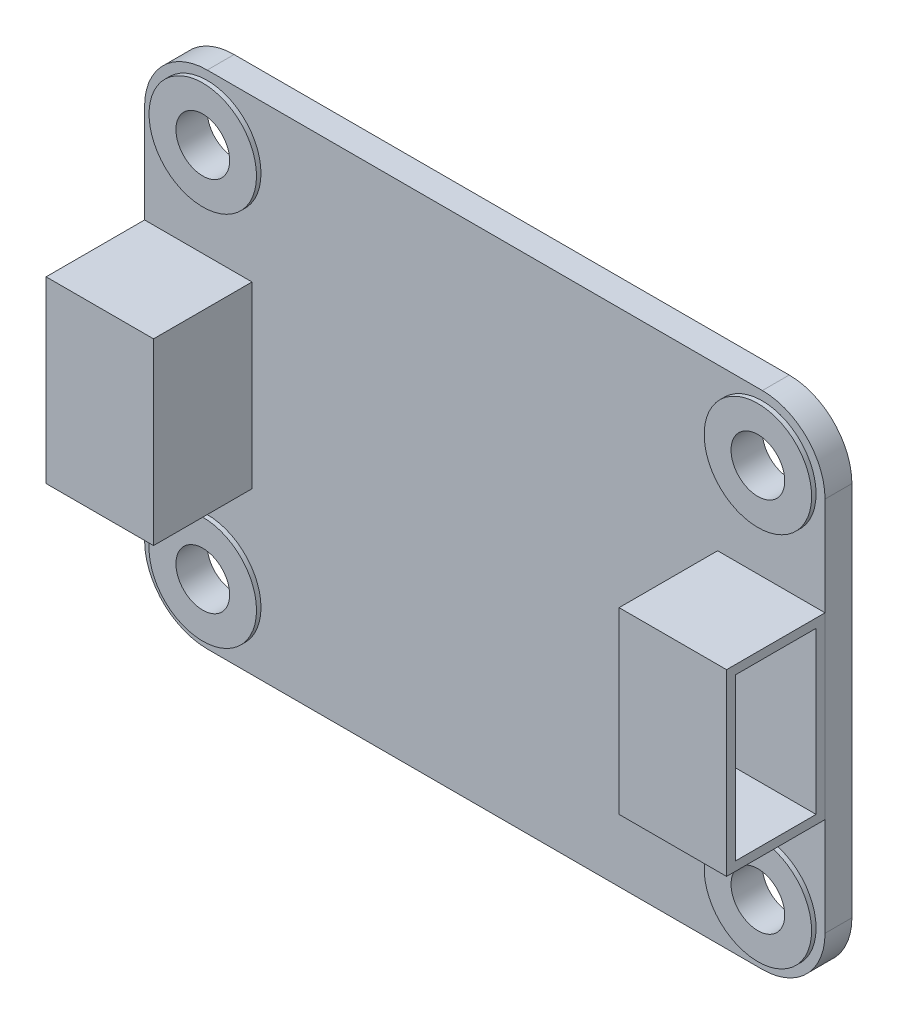
ISO-10303-21;
HEADER;
FILE_DESCRIPTION(('STEP AP214'),'2;1');
FILE_NAME('part.step','',(''),(''),'','','');
FILE_SCHEMA(('AUTOMOTIVE_DESIGN { 1 0 10303 214 1 1 1 1 }'));
ENDSEC;
DATA;
#1=APPLICATION_CONTEXT('core data for automotive mechanical design processes');
#2=APPLICATION_PROTOCOL_DEFINITION('international standard','automotive_design',2000,#1);
#3=PRODUCT_CONTEXT('',#1,'mechanical');
#4=PRODUCT('Part','Part','',(#3));
#5=PRODUCT_RELATED_PRODUCT_CATEGORY('part','',(#4));
#6=PRODUCT_DEFINITION_FORMATION('','',#4);
#7=PRODUCT_DEFINITION_CONTEXT('part definition',#1,'design');
#8=PRODUCT_DEFINITION('design','',#6,#7);
#9=PRODUCT_DEFINITION_SHAPE('','',#8);
#10=(LENGTH_UNIT() NAMED_UNIT(*) SI_UNIT(.MILLI.,.METRE.));
#11=(NAMED_UNIT(*) PLANE_ANGLE_UNIT() SI_UNIT($,.RADIAN.));
#12=(NAMED_UNIT(*) SI_UNIT($,.STERADIAN.) SOLID_ANGLE_UNIT());
#13=UNCERTAINTY_MEASURE_WITH_UNIT(LENGTH_MEASURE(1.E-05),#10,'distance_accuracy_value','');
#14=(GEOMETRIC_REPRESENTATION_CONTEXT(3) GLOBAL_UNCERTAINTY_ASSIGNED_CONTEXT((#13)) GLOBAL_UNIT_ASSIGNED_CONTEXT((#10,
#11,#12)) REPRESENTATION_CONTEXT('',''));
#15=CARTESIAN_POINT('',(0.,0.,0.));
#16=DIRECTION('',(0.,0.,1.));
#17=DIRECTION('',(1.,0.,0.));
#18=AXIS2_PLACEMENT_3D('',#15,#16,#17);
#19=CARTESIAN_POINT('',(-19.,5.,7.));
#20=DIRECTION('',(1.,0.,0.));
#21=DIRECTION('',(0.,0.,1.));
#22=AXIS2_PLACEMENT_3D('',#19,#20,#21);
#23=PLANE('',#22);
#24=DIRECTION('',(0.,1.,0.));
#25=VECTOR('',#24,1.);
#26=CARTESIAN_POINT('',(-19.,5.,1.5));
#27=LINE('',#26,#25);
#28=CARTESIAN_POINT('',(-19.,-5.,1.5));
#29=VERTEX_POINT('',#28);
#30=CARTESIAN_POINT('',(-19.,5.,1.5));
#31=VERTEX_POINT('',#30);
#32=EDGE_CURVE('E164',#29,#31,#27,.T.);
#33=ORIENTED_EDGE('',*,*,#32,.F.);
#34=DIRECTION('',(0.,0.,-1.));
#35=VECTOR('',#34,1.);
#36=CARTESIAN_POINT('',(-19.,-5.,7.));
#37=LINE('',#36,#35);
#38=CARTESIAN_POINT('',(-19.,-5.,7.));
#39=VERTEX_POINT('',#38);
#40=EDGE_CURVE('E176',#39,#29,#37,.T.);
#41=ORIENTED_EDGE('',*,*,#40,.F.);
#42=DIRECTION('',(0.,1.,0.));
#43=VECTOR('',#42,1.);
#44=CARTESIAN_POINT('',(-19.,5.,7.));
#45=LINE('',#44,#43);
#46=CARTESIAN_POINT('',(-19.,5.,7.));
#47=VERTEX_POINT('',#46);
#48=EDGE_CURVE('E168',#39,#47,#45,.T.);
#49=ORIENTED_EDGE('',*,*,#48,.T.);
#50=DIRECTION('',(0.,0.,-1.));
#51=VECTOR('',#50,1.);
#52=CARTESIAN_POINT('',(-19.,5.,7.));
#53=LINE('',#52,#51);
#54=EDGE_CURVE('E12',#47,#31,#53,.T.);
#55=ORIENTED_EDGE('',*,*,#54,.T.);
#56=EDGE_LOOP('',(#33,#41,#49,#55));
#57=FACE_BOUND('',#56,.T.);
#58=DIRECTION('',(0.,1.,0.));
#59=VECTOR('',#58,1.);
#60=CARTESIAN_POINT('',(-19.,0.,2.));
#61=LINE('',#60,#59);
#62=CARTESIAN_POINT('',(-19.,-4.5,2.));
#63=VERTEX_POINT('',#62);
#64=CARTESIAN_POINT('',(-19.,4.5,2.));
#65=VERTEX_POINT('',#64);
#66=EDGE_CURVE('E151',#63,#65,#61,.T.);
#67=ORIENTED_EDGE('',*,*,#66,.T.);
#68=DIRECTION('',(0.,0.,-1.));
#69=VECTOR('',#68,1.);
#70=CARTESIAN_POINT('',(-19.,4.5,7.));
#71=LINE('',#70,#69);
#72=CARTESIAN_POINT('',(-19.,4.5,6.5));
#73=VERTEX_POINT('',#72);
#74=EDGE_CURVE('E145',#73,#65,#71,.T.);
#75=ORIENTED_EDGE('',*,*,#74,.F.);
#76=DIRECTION('',(0.,1.,0.));
#77=VECTOR('',#76,1.);
#78=CARTESIAN_POINT('',(-19.,0.,6.5));
#79=LINE('',#78,#77);
#80=CARTESIAN_POINT('',(-19.,-4.5,6.5));
#81=VERTEX_POINT('',#80);
#82=EDGE_CURVE('E156',#81,#73,#79,.T.);
#83=ORIENTED_EDGE('',*,*,#82,.F.);
#84=DIRECTION('',(0.,0.,-1.));
#85=VECTOR('',#84,1.);
#86=CARTESIAN_POINT('',(-19.,-4.5,7.));
#87=LINE('',#86,#85);
#88=EDGE_CURVE('E159',#81,#63,#87,.T.);
#89=ORIENTED_EDGE('',*,*,#88,.T.);
#90=EDGE_LOOP('',(#67,#75,#83,#89));
#91=FACE_BOUND('',#90,.T.);
#92=ADVANCED_FACE('F54',(#57,#91),#23,.F.);
#93=CARTESIAN_POINT('',(-19.,5.,7.));
#94=DIRECTION('',(0.,-1.,0.));
#95=DIRECTION('',(-1.,0.,0.));
#96=AXIS2_PLACEMENT_3D('',#93,#94,#95);
#97=PLANE('',#96);
#98=DIRECTION('',(1.,0.,0.));
#99=VECTOR('',#98,1.);
#100=CARTESIAN_POINT('',(-19.,5.,1.5));
#101=LINE('',#100,#99);
#102=CARTESIAN_POINT('',(-13.,5.,1.5));
#103=VERTEX_POINT('',#102);
#104=EDGE_CURVE('E178',#31,#103,#101,.T.);
#105=ORIENTED_EDGE('',*,*,#104,.F.);
#106=ORIENTED_EDGE('',*,*,#54,.F.);
#107=DIRECTION('',(1.,0.,0.));
#108=VECTOR('',#107,1.);
#109=CARTESIAN_POINT('',(-19.,5.,7.));
#110=LINE('',#109,#108);
#111=CARTESIAN_POINT('',(-13.,5.,7.));
#112=VERTEX_POINT('',#111);
#113=EDGE_CURVE('E104',#47,#112,#110,.T.);
#114=ORIENTED_EDGE('',*,*,#113,.T.);
#115=DIRECTION('',(0.,0.,-1.));
#116=VECTOR('',#115,1.);
#117=CARTESIAN_POINT('',(-13.,5.,7.));
#118=LINE('',#117,#116);
#119=EDGE_CURVE('E61',#112,#103,#118,.T.);
#120=ORIENTED_EDGE('',*,*,#119,.T.);
#121=EDGE_LOOP('',(#105,#106,#114,#120));
#122=FACE_BOUND('',#121,.T.);
#123=ADVANCED_FACE('F190',(#122),#97,.F.);
#124=CARTESIAN_POINT('',(-13.,5.,7.));
#125=DIRECTION('',(-1.,0.,0.));
#126=DIRECTION('',(0.,0.,-1.));
#127=AXIS2_PLACEMENT_3D('',#124,#125,#126);
#128=PLANE('',#127);
#129=DIRECTION('',(0.,-1.,0.));
#130=VECTOR('',#129,1.);
#131=CARTESIAN_POINT('',(-13.,5.,1.5));
#132=LINE('',#131,#130);
#133=CARTESIAN_POINT('',(-13.,-5.,1.5));
#134=VERTEX_POINT('',#133);
#135=EDGE_CURVE('E181',#103,#134,#132,.T.);
#136=ORIENTED_EDGE('',*,*,#135,.F.);
#137=ORIENTED_EDGE('',*,*,#119,.F.);
#138=DIRECTION('',(0.,-1.,0.));
#139=VECTOR('',#138,1.);
#140=CARTESIAN_POINT('',(-13.,5.,7.));
#141=LINE('',#140,#139);
#142=CARTESIAN_POINT('',(-13.,-5.,7.));
#143=VERTEX_POINT('',#142);
#144=EDGE_CURVE('E172',#112,#143,#141,.T.);
#145=ORIENTED_EDGE('',*,*,#144,.T.);
#146=DIRECTION('',(0.,0.,-1.));
#147=VECTOR('',#146,1.);
#148=CARTESIAN_POINT('',(-13.,-5.,7.));
#149=LINE('',#148,#147);
#150=EDGE_CURVE('E185',#143,#134,#149,.T.);
#151=ORIENTED_EDGE('',*,*,#150,.T.);
#152=EDGE_LOOP('',(#136,#137,#145,#151));
#153=FACE_BOUND('',#152,.T.);
#154=ADVANCED_FACE('F199',(#153),#128,.F.);
#155=CARTESIAN_POINT('',(-19.,-5.,7.));
#156=DIRECTION('',(0.,1.,0.));
#157=DIRECTION('',(1.,0.,0.));
#158=AXIS2_PLACEMENT_3D('',#155,#156,#157);
#159=PLANE('',#158);
#160=DIRECTION('',(-1.,0.,0.));
#161=VECTOR('',#160,1.);
#162=CARTESIAN_POINT('',(-19.,-5.,1.5));
#163=LINE('',#162,#161);
#164=EDGE_CURVE('E98',#134,#29,#163,.T.);
#165=ORIENTED_EDGE('',*,*,#164,.F.);
#166=ORIENTED_EDGE('',*,*,#150,.F.);
#167=DIRECTION('',(-1.,0.,0.));
#168=VECTOR('',#167,1.);
#169=CARTESIAN_POINT('',(-19.,-5.,7.));
#170=LINE('',#169,#168);
#171=EDGE_CURVE('E77',#143,#39,#170,.T.);
#172=ORIENTED_EDGE('',*,*,#171,.T.);
#173=ORIENTED_EDGE('',*,*,#40,.T.);
#174=EDGE_LOOP('',(#165,#166,#172,#173));
#175=FACE_BOUND('',#174,.T.);
#176=ADVANCED_FACE('F198',(#175),#159,.F.);
#177=CARTESIAN_POINT('',(0.,0.,7.));
#178=DIRECTION('',(0.,0.,-1.));
#179=DIRECTION('',(1.,0.,0.));
#180=AXIS2_PLACEMENT_3D('',#177,#178,#179);
#181=PLANE('',#180);
#182=ORIENTED_EDGE('',*,*,#48,.F.);
#183=ORIENTED_EDGE('',*,*,#171,.F.);
#184=ORIENTED_EDGE('',*,*,#144,.F.);
#185=ORIENTED_EDGE('',*,*,#113,.F.);
#186=EDGE_LOOP('',(#182,#183,#184,#185));
#187=FACE_BOUND('',#186,.T.);
#188=ADVANCED_FACE('F197',(#187),#181,.F.);
#189=CARTESIAN_POINT('',(0.,0.,1.5));
#190=DIRECTION('',(0.,0.,-1.));
#191=DIRECTION('',(1.,0.,0.));
#192=AXIS2_PLACEMENT_3D('',#189,#190,#191);
#193=PLANE('',#192);
#194=ORIENTED_EDGE('',*,*,#32,.T.);
#195=ORIENTED_EDGE('',*,*,#104,.T.);
#196=ORIENTED_EDGE('',*,*,#135,.T.);
#197=ORIENTED_EDGE('',*,*,#164,.T.);
#198=EDGE_LOOP('',(#194,#195,#196,#197));
#199=FACE_BOUND('',#198,.T.);
#200=ADVANCED_FACE('F192',(#199),#193,.T.);
#201=CARTESIAN_POINT('',(-19.,4.5,7.));
#202=DIRECTION('',(0.,-1.,0.));
#203=DIRECTION('',(-1.,0.,0.));
#204=AXIS2_PLACEMENT_3D('',#201,#202,#203);
#205=PLANE('',#204);
#206=DIRECTION('',(1.,0.,0.));
#207=VECTOR('',#206,1.);
#208=CARTESIAN_POINT('',(0.,4.5,2.));
#209=LINE('',#208,#207);
#210=CARTESIAN_POINT('',(-13.5,4.5,2.));
#211=VERTEX_POINT('',#210);
#212=EDGE_CURVE('E132',#65,#211,#209,.T.);
#213=ORIENTED_EDGE('',*,*,#212,.T.);
#214=DIRECTION('',(0.,0.,-1.));
#215=VECTOR('',#214,1.);
#216=CARTESIAN_POINT('',(-13.5,4.5,7.));
#217=LINE('',#216,#215);
#218=CARTESIAN_POINT('',(-13.5,4.5,6.5));
#219=VERTEX_POINT('',#218);
#220=EDGE_CURVE('E140',#219,#211,#217,.T.);
#221=ORIENTED_EDGE('',*,*,#220,.F.);
#222=DIRECTION('',(1.,0.,0.));
#223=VECTOR('',#222,1.);
#224=CARTESIAN_POINT('',(0.,4.5,6.5));
#225=LINE('',#224,#223);
#226=EDGE_CURVE('E155',#73,#219,#225,.T.);
#227=ORIENTED_EDGE('',*,*,#226,.F.);
#228=ORIENTED_EDGE('',*,*,#74,.T.);
#229=EDGE_LOOP('',(#213,#221,#227,#228));
#230=FACE_BOUND('',#229,.T.);
#231=ADVANCED_FACE('F148',(#230),#205,.T.);
#232=CARTESIAN_POINT('',(-13.5,5.,7.));
#233=DIRECTION('',(-1.,0.,0.));
#234=DIRECTION('',(0.,0.,-1.));
#235=AXIS2_PLACEMENT_3D('',#232,#233,#234);
#236=PLANE('',#235);
#237=DIRECTION('',(0.,-1.,0.));
#238=VECTOR('',#237,1.);
#239=CARTESIAN_POINT('',(-13.5,0.,2.));
#240=LINE('',#239,#238);
#241=CARTESIAN_POINT('',(-13.5,-4.5,2.));
#242=VERTEX_POINT('',#241);
#243=EDGE_CURVE('E127',#211,#242,#240,.T.);
#244=ORIENTED_EDGE('',*,*,#243,.T.);
#245=DIRECTION('',(0.,0.,-1.));
#246=VECTOR('',#245,1.);
#247=CARTESIAN_POINT('',(-13.5,-4.5,7.));
#248=LINE('',#247,#246);
#249=CARTESIAN_POINT('',(-13.5,-4.5,6.5));
#250=VERTEX_POINT('',#249);
#251=EDGE_CURVE('E146',#250,#242,#248,.T.);
#252=ORIENTED_EDGE('',*,*,#251,.F.);
#253=DIRECTION('',(0.,-1.,0.));
#254=VECTOR('',#253,1.);
#255=CARTESIAN_POINT('',(-13.5,0.,6.5));
#256=LINE('',#255,#254);
#257=EDGE_CURVE('E142',#219,#250,#256,.T.);
#258=ORIENTED_EDGE('',*,*,#257,.F.);
#259=ORIENTED_EDGE('',*,*,#220,.T.);
#260=EDGE_LOOP('',(#244,#252,#258,#259));
#261=FACE_BOUND('',#260,.T.);
#262=ADVANCED_FACE('F141',(#261),#236,.T.);
#263=CARTESIAN_POINT('',(-19.,-4.5,7.));
#264=DIRECTION('',(0.,1.,0.));
#265=DIRECTION('',(1.,0.,0.));
#266=AXIS2_PLACEMENT_3D('',#263,#264,#265);
#267=PLANE('',#266);
#268=DIRECTION('',(-1.,0.,0.));
#269=VECTOR('',#268,1.);
#270=CARTESIAN_POINT('',(0.,-4.50000000000001,2.));
#271=LINE('',#270,#269);
#272=EDGE_CURVE('E134',#242,#63,#271,.T.);
#273=ORIENTED_EDGE('',*,*,#272,.T.);
#274=ORIENTED_EDGE('',*,*,#88,.F.);
#275=DIRECTION('',(-1.,0.,0.));
#276=VECTOR('',#275,1.);
#277=CARTESIAN_POINT('',(0.,-4.50000000000001,6.5));
#278=LINE('',#277,#276);
#279=EDGE_CURVE('E68',#250,#81,#278,.T.);
#280=ORIENTED_EDGE('',*,*,#279,.F.);
#281=ORIENTED_EDGE('',*,*,#251,.T.);
#282=EDGE_LOOP('',(#273,#274,#280,#281));
#283=FACE_BOUND('',#282,.T.);
#284=ADVANCED_FACE('F257',(#283),#267,.T.);
#285=CARTESIAN_POINT('',(0.,0.,6.5));
#286=DIRECTION('',(0.,0.,-1.));
#287=DIRECTION('',(1.,0.,0.));
#288=AXIS2_PLACEMENT_3D('',#285,#286,#287);
#289=PLANE('',#288);
#290=ORIENTED_EDGE('',*,*,#82,.T.);
#291=ORIENTED_EDGE('',*,*,#226,.T.);
#292=ORIENTED_EDGE('',*,*,#257,.T.);
#293=ORIENTED_EDGE('',*,*,#279,.T.);
#294=EDGE_LOOP('',(#290,#291,#292,#293));
#295=FACE_BOUND('',#294,.T.);
#296=ADVANCED_FACE('F266',(#295),#289,.T.);
#297=CARTESIAN_POINT('',(0.,0.,2.));
#298=DIRECTION('',(0.,0.,-1.));
#299=DIRECTION('',(1.,0.,0.));
#300=AXIS2_PLACEMENT_3D('',#297,#298,#299);
#301=PLANE('',#300);
#302=ORIENTED_EDGE('',*,*,#66,.F.);
#303=ORIENTED_EDGE('',*,*,#272,.F.);
#304=ORIENTED_EDGE('',*,*,#243,.F.);
#305=ORIENTED_EDGE('',*,*,#212,.F.);
#306=EDGE_LOOP('',(#302,#303,#304,#305));
#307=FACE_BOUND('',#306,.T.);
#308=ADVANCED_FACE('F130',(#307),#301,.F.);
#309=CLOSED_SHELL('',(#92,#123,#154,#176,#188,#200,#231,#262,#284,#296,#308));
#310=MANIFOLD_SOLID_BREP('B2',#309);
#311=CARTESIAN_POINT('',(19.,5.,7.));
#312=DIRECTION('',(-1.,0.,0.));
#313=DIRECTION('',(0.,0.,1.));
#314=AXIS2_PLACEMENT_3D('',#311,#312,#313);
#315=PLANE('',#314);
#316=DIRECTION('',(0.,1.,0.));
#317=VECTOR('',#316,1.);
#318=CARTESIAN_POINT('',(19.,5.,1.5));
#319=LINE('',#318,#317);
#320=CARTESIAN_POINT('',(19.,-5.,1.5));
#321=VERTEX_POINT('',#320);
#322=CARTESIAN_POINT('',(19.,5.,1.5));
#323=VERTEX_POINT('',#322);
#324=EDGE_CURVE('E433',#321,#323,#319,.T.);
#325=ORIENTED_EDGE('',*,*,#324,.T.);
#326=DIRECTION('',(0.,0.,-1.));
#327=VECTOR('',#326,1.);
#328=CARTESIAN_POINT('',(19.,5.,7.));
#329=LINE('',#328,#327);
#330=CARTESIAN_POINT('',(19.,5.,7.));
#331=VERTEX_POINT('',#330);
#332=EDGE_CURVE('E52',#331,#323,#329,.T.);
#333=ORIENTED_EDGE('',*,*,#332,.F.);
#334=DIRECTION('',(0.,1.,0.));
#335=VECTOR('',#334,1.);
#336=CARTESIAN_POINT('',(19.,5.,7.));
#337=LINE('',#336,#335);
#338=CARTESIAN_POINT('',(19.,-5.,7.));
#339=VERTEX_POINT('',#338);
#340=EDGE_CURVE('E438',#339,#331,#337,.T.);
#341=ORIENTED_EDGE('',*,*,#340,.F.);
#342=DIRECTION('',(0.,0.,-1.));
#343=VECTOR('',#342,1.);
#344=CARTESIAN_POINT('',(19.,-5.,7.));
#345=LINE('',#344,#343);
#346=EDGE_CURVE('E444',#339,#321,#345,.T.);
#347=ORIENTED_EDGE('',*,*,#346,.T.);
#348=EDGE_LOOP('',(#325,#333,#341,#347));
#349=FACE_BOUND('',#348,.T.);
#350=DIRECTION('',(0.,1.,0.));
#351=VECTOR('',#350,1.);
#352=CARTESIAN_POINT('',(19.,0.,2.));
#353=LINE('',#352,#351);
#354=CARTESIAN_POINT('',(19.,-4.5,2.));
#355=VERTEX_POINT('',#354);
#356=CARTESIAN_POINT('',(19.,4.5,2.));
#357=VERTEX_POINT('',#356);
#358=EDGE_CURVE('E404',#355,#357,#353,.T.);
#359=ORIENTED_EDGE('',*,*,#358,.F.);
#360=DIRECTION('',(0.,0.,-1.));
#361=VECTOR('',#360,1.);
#362=CARTESIAN_POINT('',(19.,-4.5,7.));
#363=LINE('',#362,#361);
#364=CARTESIAN_POINT('',(19.,-4.5,6.5));
#365=VERTEX_POINT('',#364);
#366=EDGE_CURVE('E427',#365,#355,#363,.T.);
#367=ORIENTED_EDGE('',*,*,#366,.F.);
#368=DIRECTION('',(0.,1.,0.));
#369=VECTOR('',#368,1.);
#370=CARTESIAN_POINT('',(19.,0.,6.5));
#371=LINE('',#370,#369);
#372=CARTESIAN_POINT('',(19.,4.5,6.5));
#373=VERTEX_POINT('',#372);
#374=EDGE_CURVE('E338',#365,#373,#371,.T.);
#375=ORIENTED_EDGE('',*,*,#374,.T.);
#376=DIRECTION('',(0.,0.,-1.));
#377=VECTOR('',#376,1.);
#378=CARTESIAN_POINT('',(19.,4.5,7.));
#379=LINE('',#378,#377);
#380=EDGE_CURVE('E415',#373,#357,#379,.T.);
#381=ORIENTED_EDGE('',*,*,#380,.T.);
#382=EDGE_LOOP('',(#359,#367,#375,#381));
#383=FACE_BOUND('',#382,.T.);
#384=ADVANCED_FACE('F324',(#349,#383),#315,.F.);
#385=CARTESIAN_POINT('',(19.,5.,7.));
#386=DIRECTION('',(0.,-1.,0.));
#387=DIRECTION('',(1.,0.,0.));
#388=AXIS2_PLACEMENT_3D('',#385,#386,#387);
#389=PLANE('',#388);
#390=DIRECTION('',(-1.,0.,0.));
#391=VECTOR('',#390,1.);
#392=CARTESIAN_POINT('',(19.,5.,1.5));
#393=LINE('',#392,#391);
#394=CARTESIAN_POINT('',(13.,5.,1.5));
#395=VERTEX_POINT('',#394);
#396=EDGE_CURVE('E447',#323,#395,#393,.T.);
#397=ORIENTED_EDGE('',*,*,#396,.T.);
#398=DIRECTION('',(0.,0.,-1.));
#399=VECTOR('',#398,1.);
#400=CARTESIAN_POINT('',(13.,5.,7.));
#401=LINE('',#400,#399);
#402=CARTESIAN_POINT('',(13.,5.,7.));
#403=VERTEX_POINT('',#402);
#404=EDGE_CURVE('E331',#403,#395,#401,.T.);
#405=ORIENTED_EDGE('',*,*,#404,.F.);
#406=DIRECTION('',(-1.,0.,0.));
#407=VECTOR('',#406,1.);
#408=CARTESIAN_POINT('',(19.,5.,7.));
#409=LINE('',#408,#407);
#410=EDGE_CURVE('E375',#331,#403,#409,.T.);
#411=ORIENTED_EDGE('',*,*,#410,.F.);
#412=ORIENTED_EDGE('',*,*,#332,.T.);
#413=EDGE_LOOP('',(#397,#405,#411,#412));
#414=FACE_BOUND('',#413,.T.);
#415=ADVANCED_FACE('F476',(#414),#389,.F.);
#416=CARTESIAN_POINT('',(13.,5.,7.));
#417=DIRECTION('',(1.,0.,0.));
#418=DIRECTION('',(0.,0.,-1.));
#419=AXIS2_PLACEMENT_3D('',#416,#417,#418);
#420=PLANE('',#419);
#421=DIRECTION('',(0.,-1.,0.));
#422=VECTOR('',#421,1.);
#423=CARTESIAN_POINT('',(13.,5.,1.5));
#424=LINE('',#423,#422);
#425=CARTESIAN_POINT('',(13.,-5.,1.5));
#426=VERTEX_POINT('',#425);
#427=EDGE_CURVE('E449',#395,#426,#424,.T.);
#428=ORIENTED_EDGE('',*,*,#427,.T.);
#429=DIRECTION('',(0.,0.,-1.));
#430=VECTOR('',#429,1.);
#431=CARTESIAN_POINT('',(13.,-5.,7.));
#432=LINE('',#431,#430);
#433=CARTESIAN_POINT('',(13.,-5.,7.));
#434=VERTEX_POINT('',#433);
#435=EDGE_CURVE('E453',#434,#426,#432,.T.);
#436=ORIENTED_EDGE('',*,*,#435,.F.);
#437=DIRECTION('',(0.,-1.,0.));
#438=VECTOR('',#437,1.);
#439=CARTESIAN_POINT('',(13.,5.,7.));
#440=LINE('',#439,#438);
#441=EDGE_CURVE('E441',#403,#434,#440,.T.);
#442=ORIENTED_EDGE('',*,*,#441,.F.);
#443=ORIENTED_EDGE('',*,*,#404,.T.);
#444=EDGE_LOOP('',(#428,#436,#442,#443));
#445=FACE_BOUND('',#444,.T.);
#446=ADVANCED_FACE('F458',(#445),#420,.F.);
#447=CARTESIAN_POINT('',(19.,-5.,7.));
#448=DIRECTION('',(0.,1.,0.));
#449=DIRECTION('',(-1.,0.,0.));
#450=AXIS2_PLACEMENT_3D('',#447,#448,#449);
#451=PLANE('',#450);
#452=DIRECTION('',(1.,0.,0.));
#453=VECTOR('',#452,1.);
#454=CARTESIAN_POINT('',(19.,-5.,1.5));
#455=LINE('',#454,#453);
#456=EDGE_CURVE('E368',#426,#321,#455,.T.);
#457=ORIENTED_EDGE('',*,*,#456,.T.);
#458=ORIENTED_EDGE('',*,*,#346,.F.);
#459=DIRECTION('',(1.,0.,0.));
#460=VECTOR('',#459,1.);
#461=CARTESIAN_POINT('',(19.,-5.,7.));
#462=LINE('',#461,#460);
#463=EDGE_CURVE('E347',#434,#339,#462,.T.);
#464=ORIENTED_EDGE('',*,*,#463,.F.);
#465=ORIENTED_EDGE('',*,*,#435,.T.);
#466=EDGE_LOOP('',(#457,#458,#464,#465));
#467=FACE_BOUND('',#466,.T.);
#468=ADVANCED_FACE('F467',(#467),#451,.F.);
#469=CARTESIAN_POINT('',(0.,0.,7.));
#470=DIRECTION('',(0.,0.,-1.));
#471=DIRECTION('',(-1.,0.,0.));
#472=AXIS2_PLACEMENT_3D('',#469,#470,#471);
#473=PLANE('',#472);
#474=ORIENTED_EDGE('',*,*,#340,.T.);
#475=ORIENTED_EDGE('',*,*,#410,.T.);
#476=ORIENTED_EDGE('',*,*,#441,.T.);
#477=ORIENTED_EDGE('',*,*,#463,.T.);
#478=EDGE_LOOP('',(#474,#475,#476,#477));
#479=FACE_BOUND('',#478,.T.);
#480=ADVANCED_FACE('F469',(#479),#473,.F.);
#481=CARTESIAN_POINT('',(0.,0.,1.5));
#482=DIRECTION('',(0.,0.,-1.));
#483=DIRECTION('',(-1.,0.,0.));
#484=AXIS2_PLACEMENT_3D('',#481,#482,#483);
#485=PLANE('',#484);
#486=ORIENTED_EDGE('',*,*,#324,.F.);
#487=ORIENTED_EDGE('',*,*,#456,.F.);
#488=ORIENTED_EDGE('',*,*,#427,.F.);
#489=ORIENTED_EDGE('',*,*,#396,.F.);
#490=EDGE_LOOP('',(#486,#487,#488,#489));
#491=FACE_BOUND('',#490,.T.);
#492=ADVANCED_FACE('F462',(#491),#485,.T.);
#493=CARTESIAN_POINT('',(19.,4.5,7.));
#494=DIRECTION('',(0.,-1.,0.));
#495=DIRECTION('',(1.,0.,0.));
#496=AXIS2_PLACEMENT_3D('',#493,#494,#495);
#497=PLANE('',#496);
#498=DIRECTION('',(-1.,0.,0.));
#499=VECTOR('',#498,1.);
#500=CARTESIAN_POINT('',(0.,4.5,2.));
#501=LINE('',#500,#499);
#502=CARTESIAN_POINT('',(13.5,4.5,2.));
#503=VERTEX_POINT('',#502);
#504=EDGE_CURVE('E397',#357,#503,#501,.T.);
#505=ORIENTED_EDGE('',*,*,#504,.F.);
#506=ORIENTED_EDGE('',*,*,#380,.F.);
#507=DIRECTION('',(-1.,0.,0.));
#508=VECTOR('',#507,1.);
#509=CARTESIAN_POINT('',(0.,4.5,6.5));
#510=LINE('',#509,#508);
#511=CARTESIAN_POINT('',(13.5,4.5,6.5));
#512=VERTEX_POINT('',#511);
#513=EDGE_CURVE('E412',#373,#512,#510,.T.);
#514=ORIENTED_EDGE('',*,*,#513,.T.);
#515=DIRECTION('',(0.,0.,-1.));
#516=VECTOR('',#515,1.);
#517=CARTESIAN_POINT('',(13.5,4.5,7.));
#518=LINE('',#517,#516);
#519=EDGE_CURVE('E410',#512,#503,#518,.T.);
#520=ORIENTED_EDGE('',*,*,#519,.T.);
#521=EDGE_LOOP('',(#505,#506,#514,#520));
#522=FACE_BOUND('',#521,.T.);
#523=ADVANCED_FACE('F411',(#522),#497,.T.);
#524=CARTESIAN_POINT('',(13.5,5.,7.));
#525=DIRECTION('',(1.,0.,0.));
#526=DIRECTION('',(0.,0.,-1.));
#527=AXIS2_PLACEMENT_3D('',#524,#525,#526);
#528=PLANE('',#527);
#529=DIRECTION('',(0.,-1.,0.));
#530=VECTOR('',#529,1.);
#531=CARTESIAN_POINT('',(13.5,0.,2.));
#532=LINE('',#531,#530);
#533=CARTESIAN_POINT('',(13.5,-4.5,2.));
#534=VERTEX_POINT('',#533);
#535=EDGE_CURVE('E401',#503,#534,#532,.T.);
#536=ORIENTED_EDGE('',*,*,#535,.F.);
#537=ORIENTED_EDGE('',*,*,#519,.F.);
#538=DIRECTION('',(0.,-1.,0.));
#539=VECTOR('',#538,1.);
#540=CARTESIAN_POINT('',(13.5,0.,6.5));
#541=LINE('',#540,#539);
#542=CARTESIAN_POINT('',(13.5,-4.5,6.5));
#543=VERTEX_POINT('',#542);
#544=EDGE_CURVE('E428',#512,#543,#541,.T.);
#545=ORIENTED_EDGE('',*,*,#544,.T.);
#546=DIRECTION('',(0.,0.,-1.));
#547=VECTOR('',#546,1.);
#548=CARTESIAN_POINT('',(13.5,-4.5,7.));
#549=LINE('',#548,#547);
#550=EDGE_CURVE('E416',#543,#534,#549,.T.);
#551=ORIENTED_EDGE('',*,*,#550,.T.);
#552=EDGE_LOOP('',(#536,#537,#545,#551));
#553=FACE_BOUND('',#552,.T.);
#554=ADVANCED_FACE('F418',(#553),#528,.T.);
#555=CARTESIAN_POINT('',(19.,-4.5,7.));
#556=DIRECTION('',(0.,1.,0.));
#557=DIRECTION('',(-1.,0.,0.));
#558=AXIS2_PLACEMENT_3D('',#555,#556,#557);
#559=PLANE('',#558);
#560=DIRECTION('',(1.,0.,0.));
#561=VECTOR('',#560,1.);
#562=CARTESIAN_POINT('',(0.,-4.50000000000001,2.));
#563=LINE('',#562,#561);
#564=EDGE_CURVE('E421',#534,#355,#563,.T.);
#565=ORIENTED_EDGE('',*,*,#564,.F.);
#566=ORIENTED_EDGE('',*,*,#550,.F.);
#567=DIRECTION('',(1.,0.,0.));
#568=VECTOR('',#567,1.);
#569=CARTESIAN_POINT('',(0.,-4.50000000000001,6.5));
#570=LINE('',#569,#568);
#571=EDGE_CURVE('E429',#543,#365,#570,.T.);
#572=ORIENTED_EDGE('',*,*,#571,.T.);
#573=ORIENTED_EDGE('',*,*,#366,.T.);
#574=EDGE_LOOP('',(#565,#566,#572,#573));
#575=FACE_BOUND('',#574,.T.);
#576=ADVANCED_FACE('F527',(#575),#559,.T.);
#577=CARTESIAN_POINT('',(0.,0.,6.5));
#578=DIRECTION('',(0.,0.,-1.));
#579=DIRECTION('',(-1.,0.,0.));
#580=AXIS2_PLACEMENT_3D('',#577,#578,#579);
#581=PLANE('',#580);
#582=ORIENTED_EDGE('',*,*,#374,.F.);
#583=ORIENTED_EDGE('',*,*,#571,.F.);
#584=ORIENTED_EDGE('',*,*,#544,.F.);
#585=ORIENTED_EDGE('',*,*,#513,.F.);
#586=EDGE_LOOP('',(#582,#583,#584,#585));
#587=FACE_BOUND('',#586,.T.);
#588=ADVANCED_FACE('F536',(#587),#581,.T.);
#589=CARTESIAN_POINT('',(0.,0.,2.));
#590=DIRECTION('',(0.,0.,-1.));
#591=DIRECTION('',(-1.,0.,0.));
#592=AXIS2_PLACEMENT_3D('',#589,#590,#591);
#593=PLANE('',#592);
#594=ORIENTED_EDGE('',*,*,#358,.T.);
#595=ORIENTED_EDGE('',*,*,#504,.T.);
#596=ORIENTED_EDGE('',*,*,#535,.T.);
#597=ORIENTED_EDGE('',*,*,#564,.T.);
#598=EDGE_LOOP('',(#594,#595,#596,#597));
#599=FACE_BOUND('',#598,.T.);
#600=ADVANCED_FACE('F399',(#599),#593,.F.);
#601=CLOSED_SHELL('',(#384,#415,#446,#468,#480,#492,#523,#554,#576,#588,#600));
#602=MANIFOLD_SOLID_BREP('B6',#601);
#603=CARTESIAN_POINT('',(0.,0.,1.5));
#604=DIRECTION('',(0.,0.,1.));
#605=DIRECTION('',(1.,0.,0.));
#606=AXIS2_PLACEMENT_3D('',#603,#604,#605);
#607=PLANE('',#606);
#608=CARTESIAN_POINT('',(-15.5,-10.5,1.5));
#609=DIRECTION('',(0.,0.,1.));
#610=DIRECTION('',(1.,0.,0.));
#611=AXIS2_PLACEMENT_3D('',#608,#609,#610);
#612=CIRCLE('',#611,3.);
#613=CARTESIAN_POINT('',(-12.5,-10.5,1.5));
#614=VERTEX_POINT('',#613);
#615=EDGE_CURVE('E774',#614,#614,#612,.T.);
#616=ORIENTED_EDGE('',*,*,#615,.F.);
#617=EDGE_LOOP('',(#616));
#618=FACE_BOUND('',#617,.T.);
#619=CARTESIAN_POINT('',(15.5,10.5,1.5));
#620=DIRECTION('',(0.,0.,1.));
#621=DIRECTION('',(1.,0.,0.));
#622=AXIS2_PLACEMENT_3D('',#619,#620,#621);
#623=CIRCLE('',#622,2.99999999999999);
#624=CARTESIAN_POINT('',(18.5,10.5,1.5));
#625=VERTEX_POINT('',#624);
#626=EDGE_CURVE('E750',#625,#625,#623,.T.);
#627=ORIENTED_EDGE('',*,*,#626,.F.);
#628=EDGE_LOOP('',(#627));
#629=FACE_BOUND('',#628,.T.);
#630=CARTESIAN_POINT('',(-15.5,10.5,1.5));
#631=DIRECTION('',(0.,0.,1.));
#632=DIRECTION('',(1.,0.,0.));
#633=AXIS2_PLACEMENT_3D('',#630,#631,#632);
#634=CIRCLE('',#633,3.5);
#635=CARTESIAN_POINT('',(-19.,10.5,1.5));
#636=VERTEX_POINT('',#635);
#637=CARTESIAN_POINT('',(-15.5,14.,1.5));
#638=VERTEX_POINT('',#637);
#639=EDGE_CURVE('E706',#636,#638,#634,.F.);
#640=ORIENTED_EDGE('',*,*,#639,.F.);
#641=DIRECTION('',(0.,1.,0.));
#642=VECTOR('',#641,1.);
#643=CARTESIAN_POINT('',(-19.,0.,1.5));
#644=LINE('',#643,#642);
#645=CARTESIAN_POINT('',(-19.,-10.5,1.5));
#646=VERTEX_POINT('',#645);
#647=EDGE_CURVE('E741',#646,#636,#644,.T.);
#648=ORIENTED_EDGE('',*,*,#647,.F.);
#649=CARTESIAN_POINT('',(-15.5,-10.5,1.5));
#650=DIRECTION('',(0.,0.,1.));
#651=DIRECTION('',(1.,0.,0.));
#652=AXIS2_PLACEMENT_3D('',#649,#650,#651);
#653=CIRCLE('',#652,3.5);
#654=CARTESIAN_POINT('',(-15.5,-14.,1.5));
#655=VERTEX_POINT('',#654);
#656=EDGE_CURVE('E726',#655,#646,#653,.F.);
#657=ORIENTED_EDGE('',*,*,#656,.F.);
#658=DIRECTION('',(1.,0.,0.));
#659=VECTOR('',#658,1.);
#660=CARTESIAN_POINT('',(0.,-14.,1.5));
#661=LINE('',#660,#659);
#662=CARTESIAN_POINT('',(15.5,-14.,1.5));
#663=VERTEX_POINT('',#662);
#664=EDGE_CURVE('E738',#655,#663,#661,.T.);
#665=ORIENTED_EDGE('',*,*,#664,.T.);
#666=CARTESIAN_POINT('',(15.5,-10.5,1.5));
#667=DIRECTION('',(0.,0.,1.));
#668=DIRECTION('',(1.,0.,0.));
#669=AXIS2_PLACEMENT_3D('',#666,#667,#668);
#670=CIRCLE('',#669,3.5);
#671=CARTESIAN_POINT('',(19.,-10.5,1.5));
#672=VERTEX_POINT('',#671);
#673=EDGE_CURVE('E638',#663,#672,#670,.T.);
#674=ORIENTED_EDGE('',*,*,#673,.T.);
#675=DIRECTION('',(0.,1.,0.));
#676=VECTOR('',#675,1.);
#677=CARTESIAN_POINT('',(19.,0.,1.5));
#678=LINE('',#677,#676);
#679=CARTESIAN_POINT('',(19.,10.5,1.5));
#680=VERTEX_POINT('',#679);
#681=EDGE_CURVE('E631',#672,#680,#678,.T.);
#682=ORIENTED_EDGE('',*,*,#681,.T.);
#683=CARTESIAN_POINT('',(15.5,10.5,1.5));
#684=DIRECTION('',(0.,0.,1.));
#685=DIRECTION('',(1.,0.,0.));
#686=AXIS2_PLACEMENT_3D('',#683,#684,#685);
#687=CIRCLE('',#686,3.5);
#688=CARTESIAN_POINT('',(15.5,14.,1.5));
#689=VERTEX_POINT('',#688);
#690=EDGE_CURVE('E636',#689,#680,#687,.F.);
#691=ORIENTED_EDGE('',*,*,#690,.F.);
#692=DIRECTION('',(1.,0.,0.));
#693=VECTOR('',#692,1.);
#694=CARTESIAN_POINT('',(0.,14.,1.5));
#695=LINE('',#694,#693);
#696=EDGE_CURVE('E655',#638,#689,#695,.T.);
#697=ORIENTED_EDGE('',*,*,#696,.F.);
#698=EDGE_LOOP('',(#640,#648,#657,#665,#674,#682,#691,#697));
#699=FACE_BOUND('',#698,.T.);
#700=CARTESIAN_POINT('',(-15.5,10.5,1.5));
#701=DIRECTION('',(0.,0.,1.));
#702=DIRECTION('',(1.,0.,0.));
#703=AXIS2_PLACEMENT_3D('',#700,#701,#702);
#704=CIRCLE('',#703,3.);
#705=CARTESIAN_POINT('',(-12.5,10.5,1.5));
#706=VERTEX_POINT('',#705);
#707=EDGE_CURVE('E762',#706,#706,#704,.T.);
#708=ORIENTED_EDGE('',*,*,#707,.F.);
#709=EDGE_LOOP('',(#708));
#710=FACE_BOUND('',#709,.T.);
#711=CARTESIAN_POINT('',(15.5,-10.5,1.5));
#712=DIRECTION('',(0.,0.,1.));
#713=DIRECTION('',(1.,0.,0.));
#714=AXIS2_PLACEMENT_3D('',#711,#712,#713);
#715=CIRCLE('',#714,2.99999999999999);
#716=CARTESIAN_POINT('',(18.5,-10.5,1.5));
#717=VERTEX_POINT('',#716);
#718=EDGE_CURVE('E786',#717,#717,#715,.T.);
#719=ORIENTED_EDGE('',*,*,#718,.F.);
#720=EDGE_LOOP('',(#719));
#721=FACE_BOUND('',#720,.T.);
#722=ADVANCED_FACE('F563',(#618,#629,#699,#710,#721),#607,.T.);
#723=CARTESIAN_POINT('',(-15.5,10.5,1.5));
#724=DIRECTION('',(0.,0.,-1.));
#725=DIRECTION('',(-1.,0.,0.));
#726=AXIS2_PLACEMENT_3D('',#723,#724,#725);
#727=CYLINDRICAL_SURFACE('',#726,3.5);
#728=CARTESIAN_POINT('',(-15.5,10.5,0.));
#729=DIRECTION('',(0.,0.,1.));
#730=DIRECTION('',(1.,0.,0.));
#731=AXIS2_PLACEMENT_3D('',#728,#729,#730);
#732=CIRCLE('',#731,3.5);
#733=CARTESIAN_POINT('',(-19.,10.5,0.));
#734=VERTEX_POINT('',#733);
#735=CARTESIAN_POINT('',(-15.5,14.,0.));
#736=VERTEX_POINT('',#735);
#737=EDGE_CURVE('E678',#734,#736,#732,.F.);
#738=ORIENTED_EDGE('',*,*,#737,.F.);
#739=DIRECTION('',(0.,0.,-1.));
#740=VECTOR('',#739,1.);
#741=CARTESIAN_POINT('',(-19.,10.5,1.5));
#742=LINE('',#741,#740);
#743=EDGE_CURVE('E322',#636,#734,#742,.T.);
#744=ORIENTED_EDGE('',*,*,#743,.F.);
#745=ORIENTED_EDGE('',*,*,#639,.T.);
#746=DIRECTION('',(0.,0.,-1.));
#747=VECTOR('',#746,1.);
#748=CARTESIAN_POINT('',(-15.5,14.,1.5));
#749=LINE('',#748,#747);
#750=EDGE_CURVE('E581',#638,#736,#749,.T.);
#751=ORIENTED_EDGE('',*,*,#750,.T.);
#752=EDGE_LOOP('',(#738,#744,#745,#751));
#753=FACE_BOUND('',#752,.T.);
#754=ADVANCED_FACE('F815',(#753),#727,.T.);
#755=CARTESIAN_POINT('',(-19.,0.,1.5));
#756=DIRECTION('',(-1.,0.,0.));
#757=DIRECTION('',(0.,0.,1.));
#758=AXIS2_PLACEMENT_3D('',#755,#756,#757);
#759=PLANE('',#758);
#760=DIRECTION('',(0.,1.,0.));
#761=VECTOR('',#760,1.);
#762=CARTESIAN_POINT('',(-19.,0.,0.));
#763=LINE('',#762,#761);
#764=CARTESIAN_POINT('',(-19.,-10.5,0.));
#765=VERTEX_POINT('',#764);
#766=EDGE_CURVE('E681',#765,#734,#763,.T.);
#767=ORIENTED_EDGE('',*,*,#766,.F.);
#768=DIRECTION('',(0.,0.,-1.));
#769=VECTOR('',#768,1.);
#770=CARTESIAN_POINT('',(-19.,-10.5,1.5));
#771=LINE('',#770,#769);
#772=EDGE_CURVE('E573',#646,#765,#771,.T.);
#773=ORIENTED_EDGE('',*,*,#772,.F.);
#774=ORIENTED_EDGE('',*,*,#647,.T.);
#775=ORIENTED_EDGE('',*,*,#743,.T.);
#776=EDGE_LOOP('',(#767,#773,#774,#775));
#777=FACE_BOUND('',#776,.T.);
#778=ADVANCED_FACE('F730',(#777),#759,.T.);
#779=CARTESIAN_POINT('',(-15.5,-10.5,1.5));
#780=DIRECTION('',(0.,0.,-1.));
#781=DIRECTION('',(-1.,0.,0.));
#782=AXIS2_PLACEMENT_3D('',#779,#780,#781);
#783=CYLINDRICAL_SURFACE('',#782,3.5);
#784=CARTESIAN_POINT('',(-15.5,-10.5,0.));
#785=DIRECTION('',(0.,0.,1.));
#786=DIRECTION('',(1.,0.,0.));
#787=AXIS2_PLACEMENT_3D('',#784,#785,#786);
#788=CIRCLE('',#787,3.5);
#789=CARTESIAN_POINT('',(-15.5,-14.,0.));
#790=VERTEX_POINT('',#789);
#791=EDGE_CURVE('E685',#790,#765,#788,.F.);
#792=ORIENTED_EDGE('',*,*,#791,.F.);
#793=DIRECTION('',(0.,0.,-1.));
#794=VECTOR('',#793,1.);
#795=CARTESIAN_POINT('',(-15.5,-14.,1.5));
#796=LINE('',#795,#794);
#797=EDGE_CURVE('E717',#655,#790,#796,.T.);
#798=ORIENTED_EDGE('',*,*,#797,.F.);
#799=ORIENTED_EDGE('',*,*,#656,.T.);
#800=ORIENTED_EDGE('',*,*,#772,.T.);
#801=EDGE_LOOP('',(#792,#798,#799,#800));
#802=FACE_BOUND('',#801,.T.);
#803=ADVANCED_FACE('F724',(#802),#783,.T.);
#804=CARTESIAN_POINT('',(0.,-14.,1.5));
#805=DIRECTION('',(0.,1.,0.));
#806=DIRECTION('',(0.,0.,1.));
#807=AXIS2_PLACEMENT_3D('',#804,#805,#806);
#808=PLANE('',#807);
#809=DIRECTION('',(1.,0.,0.));
#810=VECTOR('',#809,1.);
#811=CARTESIAN_POINT('',(0.,-14.,0.));
#812=LINE('',#811,#810);
#813=CARTESIAN_POINT('',(15.5,-14.,0.));
#814=VERTEX_POINT('',#813);
#815=EDGE_CURVE('E689',#790,#814,#812,.T.);
#816=ORIENTED_EDGE('',*,*,#815,.T.);
#817=DIRECTION('',(0.,0.,-1.));
#818=VECTOR('',#817,1.);
#819=CARTESIAN_POINT('',(15.5,-14.,1.5));
#820=LINE('',#819,#818);
#821=EDGE_CURVE('E713',#663,#814,#820,.T.);
#822=ORIENTED_EDGE('',*,*,#821,.F.);
#823=ORIENTED_EDGE('',*,*,#664,.F.);
#824=ORIENTED_EDGE('',*,*,#797,.T.);
#825=EDGE_LOOP('',(#816,#822,#823,#824));
#826=FACE_BOUND('',#825,.T.);
#827=ADVANCED_FACE('F736',(#826),#808,.F.);
#828=CARTESIAN_POINT('',(15.5,-10.5,1.5));
#829=DIRECTION('',(0.,0.,-1.));
#830=DIRECTION('',(-1.,0.,0.));
#831=AXIS2_PLACEMENT_3D('',#828,#829,#830);
#832=CYLINDRICAL_SURFACE('',#831,3.5);
#833=CARTESIAN_POINT('',(15.5,-10.5,0.));
#834=DIRECTION('',(0.,0.,1.));
#835=DIRECTION('',(1.,0.,0.));
#836=AXIS2_PLACEMENT_3D('',#833,#834,#835);
#837=CIRCLE('',#836,3.5);
#838=CARTESIAN_POINT('',(19.,-10.5,0.));
#839=VERTEX_POINT('',#838);
#840=EDGE_CURVE('E693',#814,#839,#837,.T.);
#841=ORIENTED_EDGE('',*,*,#840,.T.);
#842=DIRECTION('',(0.,0.,-1.));
#843=VECTOR('',#842,1.);
#844=CARTESIAN_POINT('',(19.,-10.5,1.5));
#845=LINE('',#844,#843);
#846=EDGE_CURVE('E651',#672,#839,#845,.T.);
#847=ORIENTED_EDGE('',*,*,#846,.F.);
#848=ORIENTED_EDGE('',*,*,#673,.F.);
#849=ORIENTED_EDGE('',*,*,#821,.T.);
#850=EDGE_LOOP('',(#841,#847,#848,#849));
#851=FACE_BOUND('',#850,.T.);
#852=ADVANCED_FACE('F840',(#851),#832,.T.);
#853=CARTESIAN_POINT('',(19.,0.,1.5));
#854=DIRECTION('',(-1.,0.,0.));
#855=DIRECTION('',(0.,0.,1.));
#856=AXIS2_PLACEMENT_3D('',#853,#854,#855);
#857=PLANE('',#856);
#858=DIRECTION('',(0.,1.,0.));
#859=VECTOR('',#858,1.);
#860=CARTESIAN_POINT('',(19.,0.,0.));
#861=LINE('',#860,#859);
#862=CARTESIAN_POINT('',(19.,10.5,0.));
#863=VERTEX_POINT('',#862);
#864=EDGE_CURVE('E647',#839,#863,#861,.T.);
#865=ORIENTED_EDGE('',*,*,#864,.T.);
#866=DIRECTION('',(0.,0.,-1.));
#867=VECTOR('',#866,1.);
#868=CARTESIAN_POINT('',(19.,10.5,1.5));
#869=LINE('',#868,#867);
#870=EDGE_CURVE('E645',#680,#863,#869,.T.);
#871=ORIENTED_EDGE('',*,*,#870,.F.);
#872=ORIENTED_EDGE('',*,*,#681,.F.);
#873=ORIENTED_EDGE('',*,*,#846,.T.);
#874=EDGE_LOOP('',(#865,#871,#872,#873));
#875=FACE_BOUND('',#874,.T.);
#876=ADVANCED_FACE('F646',(#875),#857,.F.);
#877=CARTESIAN_POINT('',(15.5,10.5,1.5));
#878=DIRECTION('',(0.,0.,-1.));
#879=DIRECTION('',(-1.,0.,0.));
#880=AXIS2_PLACEMENT_3D('',#877,#878,#879);
#881=CYLINDRICAL_SURFACE('',#880,3.5);
#882=CARTESIAN_POINT('',(15.5,10.5,0.));
#883=DIRECTION('',(0.,0.,1.));
#884=DIRECTION('',(1.,0.,0.));
#885=AXIS2_PLACEMENT_3D('',#882,#883,#884);
#886=CIRCLE('',#885,3.5);
#887=CARTESIAN_POINT('',(15.5,14.,0.));
#888=VERTEX_POINT('',#887);
#889=EDGE_CURVE('E699',#888,#863,#886,.F.);
#890=ORIENTED_EDGE('',*,*,#889,.F.);
#891=DIRECTION('',(0.,0.,-1.));
#892=VECTOR('',#891,1.);
#893=CARTESIAN_POINT('',(15.5,14.,1.5));
#894=LINE('',#893,#892);
#895=EDGE_CURVE('E606',#689,#888,#894,.T.);
#896=ORIENTED_EDGE('',*,*,#895,.F.);
#897=ORIENTED_EDGE('',*,*,#690,.T.);
#898=ORIENTED_EDGE('',*,*,#870,.T.);
#899=EDGE_LOOP('',(#890,#896,#897,#898));
#900=FACE_BOUND('',#899,.T.);
#901=ADVANCED_FACE('F653',(#900),#881,.T.);
#902=CARTESIAN_POINT('',(-15.5,10.5,1.5));
#903=DIRECTION('',(0.,0.,-1.));
#904=DIRECTION('',(-1.,0.,0.));
#905=AXIS2_PLACEMENT_3D('',#902,#903,#904);
#906=CYLINDRICAL_SURFACE('',#905,1.5);
#907=CARTESIAN_POINT('',(-15.5,10.5,0.));
#908=DIRECTION('',(0.,0.,1.));
#909=DIRECTION('',(1.,0.,0.));
#910=AXIS2_PLACEMENT_3D('',#907,#908,#909);
#911=CIRCLE('',#910,1.5);
#912=CARTESIAN_POINT('',(-14.,10.5,0.));
#913=VERTEX_POINT('',#912);
#914=EDGE_CURVE('E674',#913,#913,#911,.T.);
#915=ORIENTED_EDGE('',*,*,#914,.F.);
#916=EDGE_LOOP('',(#915));
#917=FACE_BOUND('',#916,.T.);
#918=CARTESIAN_POINT('',(-15.5,10.5,1.75));
#919=DIRECTION('',(0.,0.,1.));
#920=DIRECTION('',(1.,0.,0.));
#921=AXIS2_PLACEMENT_3D('',#918,#919,#920);
#922=CIRCLE('',#921,1.5);
#923=CARTESIAN_POINT('',(-14.,10.5,1.75));
#924=VERTEX_POINT('',#923);
#925=EDGE_CURVE('E766',#924,#924,#922,.T.);
#926=ORIENTED_EDGE('',*,*,#925,.T.);
#927=EDGE_LOOP('',(#926));
#928=FACE_BOUND('',#927,.T.);
#929=ADVANCED_FACE('F837',(#917,#928),#906,.F.);
#930=CARTESIAN_POINT('',(-15.5,-10.5,1.5));
#931=DIRECTION('',(0.,0.,-1.));
#932=DIRECTION('',(-1.,0.,0.));
#933=AXIS2_PLACEMENT_3D('',#930,#931,#932);
#934=CYLINDRICAL_SURFACE('',#933,1.5);
#935=CARTESIAN_POINT('',(-15.5,-10.5,0.));
#936=DIRECTION('',(0.,0.,1.));
#937=DIRECTION('',(1.,0.,0.));
#938=AXIS2_PLACEMENT_3D('',#935,#936,#937);
#939=CIRCLE('',#938,1.5);
#940=CARTESIAN_POINT('',(-14.,-10.5,0.));
#941=VERTEX_POINT('',#940);
#942=EDGE_CURVE('E670',#941,#941,#939,.T.);
#943=ORIENTED_EDGE('',*,*,#942,.F.);
#944=EDGE_LOOP('',(#943));
#945=FACE_BOUND('',#944,.T.);
#946=CARTESIAN_POINT('',(-15.5,-10.5,1.75));
#947=DIRECTION('',(0.,0.,1.));
#948=DIRECTION('',(1.,0.,0.));
#949=AXIS2_PLACEMENT_3D('',#946,#947,#948);
#950=CIRCLE('',#949,1.5);
#951=CARTESIAN_POINT('',(-14.,-10.5,1.75));
#952=VERTEX_POINT('',#951);
#953=EDGE_CURVE('E778',#952,#952,#950,.T.);
#954=ORIENTED_EDGE('',*,*,#953,.T.);
#955=EDGE_LOOP('',(#954));
#956=FACE_BOUND('',#955,.T.);
#957=ADVANCED_FACE('F852',(#945,#956),#934,.F.);
#958=CARTESIAN_POINT('',(15.5,10.5,1.5));
#959=DIRECTION('',(0.,0.,-1.));
#960=DIRECTION('',(-1.,0.,0.));
#961=AXIS2_PLACEMENT_3D('',#958,#959,#960);
#962=CYLINDRICAL_SURFACE('',#961,1.5);
#963=CARTESIAN_POINT('',(15.5,10.5,0.));
#964=DIRECTION('',(0.,0.,1.));
#965=DIRECTION('',(1.,0.,0.));
#966=AXIS2_PLACEMENT_3D('',#963,#964,#965);
#967=CIRCLE('',#966,1.5);
#968=CARTESIAN_POINT('',(17.,10.5,0.));
#969=VERTEX_POINT('',#968);
#970=EDGE_CURVE('E665',#969,#969,#967,.T.);
#971=ORIENTED_EDGE('',*,*,#970,.F.);
#972=EDGE_LOOP('',(#971));
#973=FACE_BOUND('',#972,.T.);
#974=CARTESIAN_POINT('',(15.5,10.5,1.75));
#975=DIRECTION('',(0.,0.,1.));
#976=DIRECTION('',(1.,0.,0.));
#977=AXIS2_PLACEMENT_3D('',#974,#975,#976);
#978=CIRCLE('',#977,1.5);
#979=CARTESIAN_POINT('',(17.,10.5,1.75));
#980=VERTEX_POINT('',#979);
#981=EDGE_CURVE('E754',#980,#980,#978,.T.);
#982=ORIENTED_EDGE('',*,*,#981,.T.);
#983=EDGE_LOOP('',(#982));
#984=FACE_BOUND('',#983,.T.);
#985=ADVANCED_FACE('F855',(#973,#984),#962,.F.);
#986=CARTESIAN_POINT('',(15.5,-10.5,1.5));
#987=DIRECTION('',(0.,0.,-1.));
#988=DIRECTION('',(-1.,0.,0.));
#989=AXIS2_PLACEMENT_3D('',#986,#987,#988);
#990=CYLINDRICAL_SURFACE('',#989,1.5);
#991=CARTESIAN_POINT('',(15.5,-10.5,0.));
#992=DIRECTION('',(0.,0.,1.));
#993=DIRECTION('',(1.,0.,0.));
#994=AXIS2_PLACEMENT_3D('',#991,#992,#993);
#995=CIRCLE('',#994,1.5);
#996=CARTESIAN_POINT('',(17.,-10.5,0.));
#997=VERTEX_POINT('',#996);
#998=EDGE_CURVE('E661',#997,#997,#995,.T.);
#999=ORIENTED_EDGE('',*,*,#998,.F.);
#1000=EDGE_LOOP('',(#999));
#1001=FACE_BOUND('',#1000,.T.);
#1002=CARTESIAN_POINT('',(15.5,-10.5,1.75));
#1003=DIRECTION('',(0.,0.,1.));
#1004=DIRECTION('',(1.,0.,0.));
#1005=AXIS2_PLACEMENT_3D('',#1002,#1003,#1004);
#1006=CIRCLE('',#1005,1.5);
#1007=CARTESIAN_POINT('',(17.,-10.5,1.75));
#1008=VERTEX_POINT('',#1007);
#1009=EDGE_CURVE('E790',#1008,#1008,#1006,.T.);
#1010=ORIENTED_EDGE('',*,*,#1009,.T.);
#1011=EDGE_LOOP('',(#1010));
#1012=FACE_BOUND('',#1011,.T.);
#1013=ADVANCED_FACE('F565',(#1001,#1012),#990,.F.);
#1014=CARTESIAN_POINT('',(0.,14.,1.5));
#1015=DIRECTION('',(0.,1.,0.));
#1016=DIRECTION('',(0.,0.,1.));
#1017=AXIS2_PLACEMENT_3D('',#1014,#1015,#1016);
#1018=PLANE('',#1017);
#1019=DIRECTION('',(1.,0.,0.));
#1020=VECTOR('',#1019,1.);
#1021=CARTESIAN_POINT('',(0.,14.,0.));
#1022=LINE('',#1021,#1020);
#1023=EDGE_CURVE('E702',#736,#888,#1022,.T.);
#1024=ORIENTED_EDGE('',*,*,#1023,.F.);
#1025=ORIENTED_EDGE('',*,*,#750,.F.);
#1026=ORIENTED_EDGE('',*,*,#696,.T.);
#1027=ORIENTED_EDGE('',*,*,#895,.T.);
#1028=EDGE_LOOP('',(#1024,#1025,#1026,#1027));
#1029=FACE_BOUND('',#1028,.T.);
#1030=ADVANCED_FACE('F831',(#1029),#1018,.T.);
#1031=CARTESIAN_POINT('',(0.,0.,0.));
#1032=DIRECTION('',(0.,0.,1.));
#1033=DIRECTION('',(1.,0.,0.));
#1034=AXIS2_PLACEMENT_3D('',#1031,#1032,#1033);
#1035=PLANE('',#1034);
#1036=ORIENTED_EDGE('',*,*,#998,.T.);
#1037=EDGE_LOOP('',(#1036));
#1038=FACE_BOUND('',#1037,.T.);
#1039=ORIENTED_EDGE('',*,*,#970,.T.);
#1040=EDGE_LOOP('',(#1039));
#1041=FACE_BOUND('',#1040,.T.);
#1042=ORIENTED_EDGE('',*,*,#942,.T.);
#1043=EDGE_LOOP('',(#1042));
#1044=FACE_BOUND('',#1043,.T.);
#1045=ORIENTED_EDGE('',*,*,#914,.T.);
#1046=EDGE_LOOP('',(#1045));
#1047=FACE_BOUND('',#1046,.T.);
#1048=ORIENTED_EDGE('',*,*,#737,.T.);
#1049=ORIENTED_EDGE('',*,*,#1023,.T.);
#1050=ORIENTED_EDGE('',*,*,#889,.T.);
#1051=ORIENTED_EDGE('',*,*,#864,.F.);
#1052=ORIENTED_EDGE('',*,*,#840,.F.);
#1053=ORIENTED_EDGE('',*,*,#815,.F.);
#1054=ORIENTED_EDGE('',*,*,#791,.T.);
#1055=ORIENTED_EDGE('',*,*,#766,.T.);
#1056=EDGE_LOOP('',(#1048,#1049,#1050,#1051,#1052,#1053,#1054,#1055));
#1057=FACE_BOUND('',#1056,.T.);
#1058=ADVANCED_FACE('F733',(#1038,#1041,#1044,#1047,#1057),#1035,.F.);
#1059=CARTESIAN_POINT('',(15.5,10.5,1.75));
#1060=DIRECTION('',(0.,0.,1.));
#1061=DIRECTION('',(1.,0.,0.));
#1062=AXIS2_PLACEMENT_3D('',#1059,#1060,#1061);
#1063=PLANE('',#1062);
#1064=CARTESIAN_POINT('',(15.5,10.5,1.75));
#1065=DIRECTION('',(0.,0.,1.));
#1066=DIRECTION('',(1.,0.,0.));
#1067=AXIS2_PLACEMENT_3D('',#1064,#1065,#1066);
#1068=CIRCLE('',#1067,2.99999999999999);
#1069=CARTESIAN_POINT('',(18.5,10.5,1.75));
#1070=VERTEX_POINT('',#1069);
#1071=EDGE_CURVE('E666',#1070,#1070,#1068,.T.);
#1072=ORIENTED_EDGE('',*,*,#1071,.T.);
#1073=EDGE_LOOP('',(#1072));
#1074=FACE_BOUND('',#1073,.T.);
#1075=ORIENTED_EDGE('',*,*,#981,.F.);
#1076=EDGE_LOOP('',(#1075));
#1077=FACE_BOUND('',#1076,.T.);
#1078=ADVANCED_FACE('F830',(#1074,#1077),#1063,.T.);
#1079=CARTESIAN_POINT('',(15.5,10.5,1.75));
#1080=DIRECTION('',(0.,0.,-1.));
#1081=DIRECTION('',(-1.,0.,0.));
#1082=AXIS2_PLACEMENT_3D('',#1079,#1080,#1081);
#1083=CYLINDRICAL_SURFACE('',#1082,2.99999999999999);
#1084=ORIENTED_EDGE('',*,*,#1071,.F.);
#1085=EDGE_LOOP('',(#1084));
#1086=FACE_BOUND('',#1085,.T.);
#1087=ORIENTED_EDGE('',*,*,#626,.T.);
#1088=EDGE_LOOP('',(#1087));
#1089=FACE_BOUND('',#1088,.T.);
#1090=ADVANCED_FACE('F826',(#1086,#1089),#1083,.T.);
#1091=CARTESIAN_POINT('',(-15.5,10.5,1.75));
#1092=DIRECTION('',(0.,0.,1.));
#1093=DIRECTION('',(1.,0.,0.));
#1094=AXIS2_PLACEMENT_3D('',#1091,#1092,#1093);
#1095=PLANE('',#1094);
#1096=CARTESIAN_POINT('',(-15.5,10.5,1.75));
#1097=DIRECTION('',(0.,0.,1.));
#1098=DIRECTION('',(1.,0.,0.));
#1099=AXIS2_PLACEMENT_3D('',#1096,#1097,#1098);
#1100=CIRCLE('',#1099,3.);
#1101=CARTESIAN_POINT('',(-12.5,10.5,1.75));
#1102=VERTEX_POINT('',#1101);
#1103=EDGE_CURVE('E761',#1102,#1102,#1100,.T.);
#1104=ORIENTED_EDGE('',*,*,#1103,.T.);
#1105=EDGE_LOOP('',(#1104));
#1106=FACE_BOUND('',#1105,.T.);
#1107=ORIENTED_EDGE('',*,*,#925,.F.);
#1108=EDGE_LOOP('',(#1107));
#1109=FACE_BOUND('',#1108,.T.);
#1110=ADVANCED_FACE('F872',(#1106,#1109),#1095,.T.);
#1111=CARTESIAN_POINT('',(-15.5,10.5,1.75));
#1112=DIRECTION('',(0.,0.,-1.));
#1113=DIRECTION('',(-1.,0.,0.));
#1114=AXIS2_PLACEMENT_3D('',#1111,#1112,#1113);
#1115=CYLINDRICAL_SURFACE('',#1114,3.);
#1116=ORIENTED_EDGE('',*,*,#1103,.F.);
#1117=EDGE_LOOP('',(#1116));
#1118=FACE_BOUND('',#1117,.T.);
#1119=ORIENTED_EDGE('',*,*,#707,.T.);
#1120=EDGE_LOOP('',(#1119));
#1121=FACE_BOUND('',#1120,.T.);
#1122=ADVANCED_FACE('F875',(#1118,#1121),#1115,.T.);
#1123=CARTESIAN_POINT('',(-15.5,-10.5,1.75));
#1124=DIRECTION('',(0.,0.,1.));
#1125=DIRECTION('',(1.,0.,0.));
#1126=AXIS2_PLACEMENT_3D('',#1123,#1124,#1125);
#1127=PLANE('',#1126);
#1128=CARTESIAN_POINT('',(-15.5,-10.5,1.75));
#1129=DIRECTION('',(0.,0.,1.));
#1130=DIRECTION('',(1.,0.,0.));
#1131=AXIS2_PLACEMENT_3D('',#1128,#1129,#1130);
#1132=CIRCLE('',#1131,3.);
#1133=CARTESIAN_POINT('',(-12.5,-10.5,1.75));
#1134=VERTEX_POINT('',#1133);
#1135=EDGE_CURVE('E773',#1134,#1134,#1132,.T.);
#1136=ORIENTED_EDGE('',*,*,#1135,.T.);
#1137=EDGE_LOOP('',(#1136));
#1138=FACE_BOUND('',#1137,.T.);
#1139=ORIENTED_EDGE('',*,*,#953,.F.);
#1140=EDGE_LOOP('',(#1139));
#1141=FACE_BOUND('',#1140,.T.);
#1142=ADVANCED_FACE('F811',(#1138,#1141),#1127,.T.);
#1143=CARTESIAN_POINT('',(-15.5,-10.5,1.75));
#1144=DIRECTION('',(0.,0.,-1.));
#1145=DIRECTION('',(-1.,0.,0.));
#1146=AXIS2_PLACEMENT_3D('',#1143,#1144,#1145);
#1147=CYLINDRICAL_SURFACE('',#1146,3.);
#1148=ORIENTED_EDGE('',*,*,#1135,.F.);
#1149=EDGE_LOOP('',(#1148));
#1150=FACE_BOUND('',#1149,.T.);
#1151=ORIENTED_EDGE('',*,*,#615,.T.);
#1152=EDGE_LOOP('',(#1151));
#1153=FACE_BOUND('',#1152,.T.);
#1154=ADVANCED_FACE('F802',(#1150,#1153),#1147,.T.);
#1155=CARTESIAN_POINT('',(15.5,-10.5,1.75));
#1156=DIRECTION('',(0.,0.,1.));
#1157=DIRECTION('',(1.,0.,0.));
#1158=AXIS2_PLACEMENT_3D('',#1155,#1156,#1157);
#1159=PLANE('',#1158);
#1160=CARTESIAN_POINT('',(15.5,-10.5,1.75));
#1161=DIRECTION('',(0.,0.,1.));
#1162=DIRECTION('',(1.,0.,0.));
#1163=AXIS2_PLACEMENT_3D('',#1160,#1161,#1162);
#1164=CIRCLE('',#1163,2.99999999999999);
#1165=CARTESIAN_POINT('',(18.5,-10.5,1.75));
#1166=VERTEX_POINT('',#1165);
#1167=EDGE_CURVE('E785',#1166,#1166,#1164,.T.);
#1168=ORIENTED_EDGE('',*,*,#1167,.T.);
#1169=EDGE_LOOP('',(#1168));
#1170=FACE_BOUND('',#1169,.T.);
#1171=ORIENTED_EDGE('',*,*,#1009,.F.);
#1172=EDGE_LOOP('',(#1171));
#1173=FACE_BOUND('',#1172,.T.);
#1174=ADVANCED_FACE('F799',(#1170,#1173),#1159,.T.);
#1175=CARTESIAN_POINT('',(15.5,-10.5,1.75));
#1176=DIRECTION('',(0.,0.,-1.));
#1177=DIRECTION('',(-1.,0.,0.));
#1178=AXIS2_PLACEMENT_3D('',#1175,#1176,#1177);
#1179=CYLINDRICAL_SURFACE('',#1178,2.99999999999999);
#1180=ORIENTED_EDGE('',*,*,#1167,.F.);
#1181=EDGE_LOOP('',(#1180));
#1182=FACE_BOUND('',#1181,.T.);
#1183=ORIENTED_EDGE('',*,*,#718,.T.);
#1184=EDGE_LOOP('',(#1183));
#1185=FACE_BOUND('',#1184,.T.);
#1186=ADVANCED_FACE('F801',(#1182,#1185),#1179,.T.);
#1187=CLOSED_SHELL('',(#722,#754,#778,#803,#827,#852,#876,#901,#929,#957,#985,#1013,#1030,#1058,
#1078,#1090,#1110,#1122,#1142,#1154,#1174,#1186));
#1188=MANIFOLD_SOLID_BREP('B46',#1187);
#1189=ADVANCED_BREP_SHAPE_REPRESENTATION('',(#18,#310,#602,#1188),#14);
#1190=SHAPE_DEFINITION_REPRESENTATION(#9,#1189);
ENDSEC;
END-ISO-10303-21;
